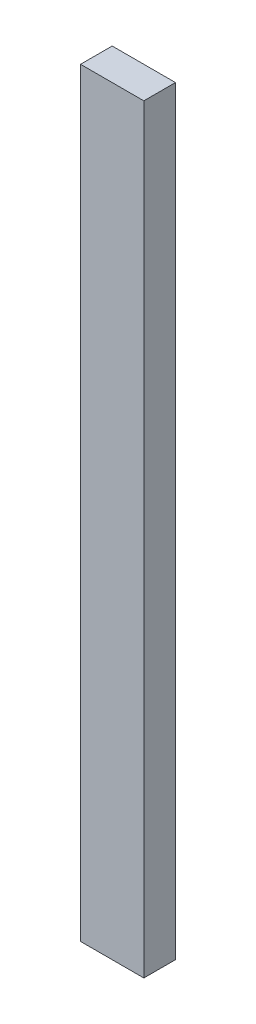
ISO-10303-21;
HEADER;
FILE_DESCRIPTION(('STEP AP214'),'2;1');
FILE_NAME('part.step','',(''),(''),'','','');
FILE_SCHEMA(('AUTOMOTIVE_DESIGN { 1 0 10303 214 1 1 1 1 }'));
ENDSEC;
DATA;
#1=APPLICATION_CONTEXT('core data for automotive mechanical design processes');
#2=APPLICATION_PROTOCOL_DEFINITION('international standard','automotive_design',2000,#1);
#3=PRODUCT_CONTEXT('',#1,'mechanical');
#4=PRODUCT('Part','Part','',(#3));
#5=PRODUCT_RELATED_PRODUCT_CATEGORY('part','',(#4));
#6=PRODUCT_DEFINITION_FORMATION('','',#4);
#7=PRODUCT_DEFINITION_CONTEXT('part definition',#1,'design');
#8=PRODUCT_DEFINITION('design','',#6,#7);
#9=PRODUCT_DEFINITION_SHAPE('','',#8);
#10=(LENGTH_UNIT() NAMED_UNIT(*) SI_UNIT(.MILLI.,.METRE.));
#11=(NAMED_UNIT(*) PLANE_ANGLE_UNIT() SI_UNIT($,.RADIAN.));
#12=(NAMED_UNIT(*) SI_UNIT($,.STERADIAN.) SOLID_ANGLE_UNIT());
#13=UNCERTAINTY_MEASURE_WITH_UNIT(LENGTH_MEASURE(1.E-05),#10,'distance_accuracy_value','');
#14=(GEOMETRIC_REPRESENTATION_CONTEXT(3) GLOBAL_UNCERTAINTY_ASSIGNED_CONTEXT((#13)) GLOBAL_UNIT_ASSIGNED_CONTEXT((#10,
#11,#12)) REPRESENTATION_CONTEXT('',''));
#15=CARTESIAN_POINT('',(0.,0.,0.));
#16=DIRECTION('',(0.,0.,1.));
#17=DIRECTION('',(1.,0.,0.));
#18=AXIS2_PLACEMENT_3D('',#15,#16,#17);
#19=CARTESIAN_POINT('',(6.35,-76.2,6.35));
#20=DIRECTION('',(-1.,0.,0.));
#21=DIRECTION('',(0.,0.,1.));
#22=AXIS2_PLACEMENT_3D('',#19,#20,#21);
#23=PLANE('',#22);
#24=DIRECTION('',(0.,1.,0.));
#25=VECTOR('',#24,1.);
#26=CARTESIAN_POINT('',(6.35,-76.2,0.));
#27=LINE('',#26,#25);
#28=CARTESIAN_POINT('',(6.35,-76.2,0.));
#29=VERTEX_POINT('',#28);
#30=CARTESIAN_POINT('',(6.35,76.2,0.));
#31=VERTEX_POINT('',#30);
#32=EDGE_CURVE('E107',#29,#31,#27,.T.);
#33=ORIENTED_EDGE('',*,*,#32,.T.);
#34=DIRECTION('',(0.,0.,-1.));
#35=VECTOR('',#34,1.);
#36=CARTESIAN_POINT('',(6.35,76.2,6.35));
#37=LINE('',#36,#35);
#38=CARTESIAN_POINT('',(6.35,76.2,6.35));
#39=VERTEX_POINT('',#38);
#40=EDGE_CURVE('E11',#39,#31,#37,.T.);
#41=ORIENTED_EDGE('',*,*,#40,.F.);
#42=DIRECTION('',(0.,1.,0.));
#43=VECTOR('',#42,1.);
#44=CARTESIAN_POINT('',(6.35,-76.2,6.35));
#45=LINE('',#44,#43);
#46=CARTESIAN_POINT('',(6.35,-76.2,6.35));
#47=VERTEX_POINT('',#46);
#48=EDGE_CURVE('E91',#47,#39,#45,.T.);
#49=ORIENTED_EDGE('',*,*,#48,.F.);
#50=DIRECTION('',(0.,0.,-1.));
#51=VECTOR('',#50,1.);
#52=CARTESIAN_POINT('',(6.35,-76.2,6.35));
#53=LINE('',#52,#51);
#54=EDGE_CURVE('E103',#47,#29,#53,.T.);
#55=ORIENTED_EDGE('',*,*,#54,.T.);
#56=EDGE_LOOP('',(#33,#41,#49,#55));
#57=FACE_BOUND('',#56,.T.);
#58=ADVANCED_FACE('F39',(#57),#23,.F.);
#59=CARTESIAN_POINT('',(-6.35,76.2,6.35));
#60=DIRECTION('',(0.,-1.,0.));
#61=DIRECTION('',(0.,0.,-1.));
#62=AXIS2_PLACEMENT_3D('',#59,#60,#61);
#63=PLANE('',#62);
#64=DIRECTION('',(-1.,0.,0.));
#65=VECTOR('',#64,1.);
#66=CARTESIAN_POINT('',(-6.35,76.2,0.));
#67=LINE('',#66,#65);
#68=CARTESIAN_POINT('',(-6.35,76.2,0.));
#69=VERTEX_POINT('',#68);
#70=EDGE_CURVE('E96',#31,#69,#67,.T.);
#71=ORIENTED_EDGE('',*,*,#70,.T.);
#72=DIRECTION('',(0.,0.,-1.));
#73=VECTOR('',#72,1.);
#74=CARTESIAN_POINT('',(-6.35,76.2,6.35));
#75=LINE('',#74,#73);
#76=CARTESIAN_POINT('',(-6.35,76.2,6.35));
#77=VERTEX_POINT('',#76);
#78=EDGE_CURVE('E48',#77,#69,#75,.T.);
#79=ORIENTED_EDGE('',*,*,#78,.F.);
#80=DIRECTION('',(-1.,0.,0.));
#81=VECTOR('',#80,1.);
#82=CARTESIAN_POINT('',(-6.35,76.2,6.35));
#83=LINE('',#82,#81);
#84=EDGE_CURVE('E86',#39,#77,#83,.T.);
#85=ORIENTED_EDGE('',*,*,#84,.F.);
#86=ORIENTED_EDGE('',*,*,#40,.T.);
#87=EDGE_LOOP('',(#71,#79,#85,#86));
#88=FACE_BOUND('',#87,.T.);
#89=ADVANCED_FACE('F95',(#88),#63,.F.);
#90=CARTESIAN_POINT('',(-6.35,-76.2,6.35));
#91=DIRECTION('',(1.,0.,0.));
#92=DIRECTION('',(0.,0.,-1.));
#93=AXIS2_PLACEMENT_3D('',#90,#91,#92);
#94=PLANE('',#93);
#95=DIRECTION('',(0.,-1.,0.));
#96=VECTOR('',#95,1.);
#97=CARTESIAN_POINT('',(-6.35,-76.2,0.));
#98=LINE('',#97,#96);
#99=CARTESIAN_POINT('',(-6.35,-76.2,0.));
#100=VERTEX_POINT('',#99);
#101=EDGE_CURVE('E73',#69,#100,#98,.T.);
#102=ORIENTED_EDGE('',*,*,#101,.T.);
#103=DIRECTION('',(0.,0.,-1.));
#104=VECTOR('',#103,1.);
#105=CARTESIAN_POINT('',(-6.35,-76.2,6.35));
#106=LINE('',#105,#104);
#107=CARTESIAN_POINT('',(-6.35,-76.2,6.35));
#108=VERTEX_POINT('',#107);
#109=EDGE_CURVE('E98',#108,#100,#106,.T.);
#110=ORIENTED_EDGE('',*,*,#109,.F.);
#111=DIRECTION('',(0.,-1.,0.));
#112=VECTOR('',#111,1.);
#113=CARTESIAN_POINT('',(-6.35,-76.2,6.35));
#114=LINE('',#113,#112);
#115=EDGE_CURVE('E89',#77,#108,#114,.T.);
#116=ORIENTED_EDGE('',*,*,#115,.F.);
#117=ORIENTED_EDGE('',*,*,#78,.T.);
#118=EDGE_LOOP('',(#102,#110,#116,#117));
#119=FACE_BOUND('',#118,.T.);
#120=ADVANCED_FACE('F99',(#119),#94,.F.);
#121=CARTESIAN_POINT('',(-6.35,-76.2,6.35));
#122=DIRECTION('',(0.,1.,0.));
#123=DIRECTION('',(0.,0.,1.));
#124=AXIS2_PLACEMENT_3D('',#121,#122,#123);
#125=PLANE('',#124);
#126=DIRECTION('',(1.,0.,0.));
#127=VECTOR('',#126,1.);
#128=CARTESIAN_POINT('',(-6.35,-76.2,0.));
#129=LINE('',#128,#127);
#130=EDGE_CURVE('E79',#100,#29,#129,.T.);
#131=ORIENTED_EDGE('',*,*,#130,.T.);
#132=ORIENTED_EDGE('',*,*,#54,.F.);
#133=DIRECTION('',(1.,0.,0.));
#134=VECTOR('',#133,1.);
#135=CARTESIAN_POINT('',(-6.35,-76.2,6.35));
#136=LINE('',#135,#134);
#137=EDGE_CURVE('E56',#108,#47,#136,.T.);
#138=ORIENTED_EDGE('',*,*,#137,.F.);
#139=ORIENTED_EDGE('',*,*,#109,.T.);
#140=EDGE_LOOP('',(#131,#132,#138,#139));
#141=FACE_BOUND('',#140,.T.);
#142=ADVANCED_FACE('F120',(#141),#125,.F.);
#143=CARTESIAN_POINT('',(0.,0.,6.35));
#144=DIRECTION('',(0.,0.,-1.));
#145=DIRECTION('',(-1.,0.,0.));
#146=AXIS2_PLACEMENT_3D('',#143,#144,#145);
#147=PLANE('',#146);
#148=ORIENTED_EDGE('',*,*,#48,.T.);
#149=ORIENTED_EDGE('',*,*,#84,.T.);
#150=ORIENTED_EDGE('',*,*,#115,.T.);
#151=ORIENTED_EDGE('',*,*,#137,.T.);
#152=EDGE_LOOP('',(#148,#149,#150,#151));
#153=FACE_BOUND('',#152,.T.);
#154=ADVANCED_FACE('F87',(#153),#147,.F.);
#155=CARTESIAN_POINT('',(0.,0.,0.));
#156=DIRECTION('',(0.,0.,-1.));
#157=DIRECTION('',(-1.,0.,0.));
#158=AXIS2_PLACEMENT_3D('',#155,#156,#157);
#159=PLANE('',#158);
#160=ORIENTED_EDGE('',*,*,#32,.F.);
#161=ORIENTED_EDGE('',*,*,#130,.F.);
#162=ORIENTED_EDGE('',*,*,#101,.F.);
#163=ORIENTED_EDGE('',*,*,#70,.F.);
#164=EDGE_LOOP('',(#160,#161,#162,#163));
#165=FACE_BOUND('',#164,.T.);
#166=ADVANCED_FACE('F123',(#165),#159,.T.);
#167=CLOSED_SHELL('',(#58,#89,#120,#142,#154,#166));
#168=MANIFOLD_SOLID_BREP('B2',#167);
#169=ADVANCED_BREP_SHAPE_REPRESENTATION('',(#18,#168),#14);
#170=SHAPE_DEFINITION_REPRESENTATION(#9,#169);
ENDSEC;
END-ISO-10303-21;
